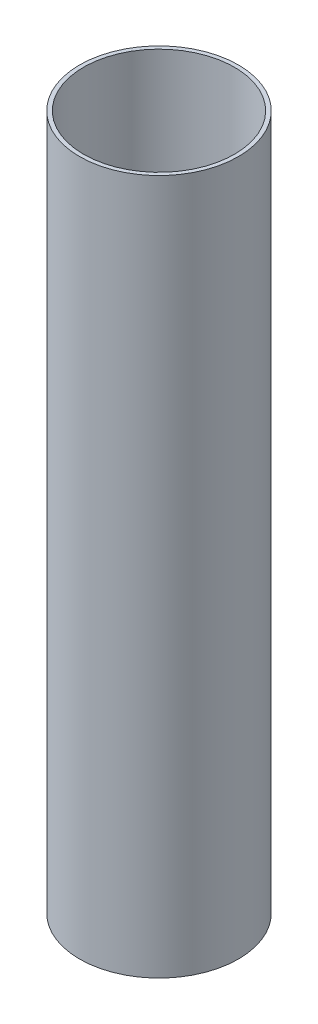
ISO-10303-21;
HEADER;
FILE_DESCRIPTION(('STEP AP214'),'2;1');
FILE_NAME('part.step','',(''),(''),'','','');
FILE_SCHEMA(('AUTOMOTIVE_DESIGN { 1 0 10303 214 1 1 1 1 }'));
ENDSEC;
DATA;
#1=APPLICATION_CONTEXT('core data for automotive mechanical design processes');
#2=APPLICATION_PROTOCOL_DEFINITION('international standard','automotive_design',2000,#1);
#3=PRODUCT_CONTEXT('',#1,'mechanical');
#4=PRODUCT('Part','Part','',(#3));
#5=PRODUCT_RELATED_PRODUCT_CATEGORY('part','',(#4));
#6=PRODUCT_DEFINITION_FORMATION('','',#4);
#7=PRODUCT_DEFINITION_CONTEXT('part definition',#1,'design');
#8=PRODUCT_DEFINITION('design','',#6,#7);
#9=PRODUCT_DEFINITION_SHAPE('','',#8);
#10=(LENGTH_UNIT() NAMED_UNIT(*) SI_UNIT(.MILLI.,.METRE.));
#11=(NAMED_UNIT(*) PLANE_ANGLE_UNIT() SI_UNIT($,.RADIAN.));
#12=(NAMED_UNIT(*) SI_UNIT($,.STERADIAN.) SOLID_ANGLE_UNIT());
#13=UNCERTAINTY_MEASURE_WITH_UNIT(LENGTH_MEASURE(1.E-05),#10,'distance_accuracy_value','');
#14=(GEOMETRIC_REPRESENTATION_CONTEXT(3) GLOBAL_UNCERTAINTY_ASSIGNED_CONTEXT((#13)) GLOBAL_UNIT_ASSIGNED_CONTEXT((#10,
#11,#12)) REPRESENTATION_CONTEXT('',''));
#15=CARTESIAN_POINT('',(0.,0.,0.));
#16=DIRECTION('',(0.,0.,1.));
#17=DIRECTION('',(1.,0.,0.));
#18=AXIS2_PLACEMENT_3D('',#15,#16,#17);
#19=CARTESIAN_POINT('',(0.,350.,0.));
#20=DIRECTION('',(0.,1.,0.));
#21=DIRECTION('',(0.,0.,1.));
#22=AXIS2_PLACEMENT_3D('',#19,#20,#21);
#23=PLANE('',#22);
#24=CARTESIAN_POINT('',(0.,350.,0.));
#25=DIRECTION('',(0.,1.,0.));
#26=DIRECTION('',(0.,0.,1.));
#27=AXIS2_PLACEMENT_3D('',#24,#25,#26);
#28=CIRCLE('',#27,40.);
#29=CARTESIAN_POINT('',(0.,350.,40.));
#30=VERTEX_POINT('',#29);
#31=EDGE_CURVE('E10',#30,#30,#28,.T.);
#32=ORIENTED_EDGE('',*,*,#31,.T.);
#33=EDGE_LOOP('',(#32));
#34=FACE_BOUND('',#33,.T.);
#35=CARTESIAN_POINT('',(0.,350.,0.));
#36=DIRECTION('',(0.,1.,0.));
#37=DIRECTION('',(0.,0.,1.));
#38=AXIS2_PLACEMENT_3D('',#35,#36,#37);
#39=CIRCLE('',#38,38.);
#40=CARTESIAN_POINT('',(0.,350.,38.));
#41=VERTEX_POINT('',#40);
#42=EDGE_CURVE('E52',#41,#41,#39,.T.);
#43=ORIENTED_EDGE('',*,*,#42,.F.);
#44=EDGE_LOOP('',(#43));
#45=FACE_BOUND('',#44,.T.);
#46=ADVANCED_FACE('F41',(#34,#45),#23,.T.);
#47=CARTESIAN_POINT('',(0.,0.,0.));
#48=DIRECTION('',(0.,1.,0.));
#49=DIRECTION('',(0.,0.,1.));
#50=AXIS2_PLACEMENT_3D('',#47,#48,#49);
#51=PLANE('',#50);
#52=CARTESIAN_POINT('',(0.,0.,0.));
#53=DIRECTION('',(0.,1.,0.));
#54=DIRECTION('',(0.,0.,1.));
#55=AXIS2_PLACEMENT_3D('',#52,#53,#54);
#56=CIRCLE('',#55,40.);
#57=CARTESIAN_POINT('',(0.,0.,40.));
#58=VERTEX_POINT('',#57);
#59=EDGE_CURVE('E45',#58,#58,#56,.T.);
#60=ORIENTED_EDGE('',*,*,#59,.F.);
#61=EDGE_LOOP('',(#60));
#62=FACE_BOUND('',#61,.T.);
#63=CARTESIAN_POINT('',(0.,0.,0.));
#64=DIRECTION('',(0.,1.,0.));
#65=DIRECTION('',(0.,0.,1.));
#66=AXIS2_PLACEMENT_3D('',#63,#64,#65);
#67=CIRCLE('',#66,38.);
#68=CARTESIAN_POINT('',(0.,0.,38.));
#69=VERTEX_POINT('',#68);
#70=EDGE_CURVE('E54',#69,#69,#67,.T.);
#71=ORIENTED_EDGE('',*,*,#70,.T.);
#72=EDGE_LOOP('',(#71));
#73=FACE_BOUND('',#72,.T.);
#74=ADVANCED_FACE('F64',(#62,#73),#51,.F.);
#75=CARTESIAN_POINT('',(0.,350.,0.));
#76=DIRECTION('',(0.,-1.,0.));
#77=DIRECTION('',(0.,0.,-1.));
#78=AXIS2_PLACEMENT_3D('',#75,#76,#77);
#79=CYLINDRICAL_SURFACE('',#78,40.);
#80=ORIENTED_EDGE('',*,*,#31,.F.);
#81=EDGE_LOOP('',(#80));
#82=FACE_BOUND('',#81,.T.);
#83=ORIENTED_EDGE('',*,*,#59,.T.);
#84=EDGE_LOOP('',(#83));
#85=FACE_BOUND('',#84,.T.);
#86=ADVANCED_FACE('F43',(#82,#85),#79,.T.);
#87=CARTESIAN_POINT('',(0.,350.,0.));
#88=DIRECTION('',(0.,-1.,0.));
#89=DIRECTION('',(0.,0.,-1.));
#90=AXIS2_PLACEMENT_3D('',#87,#88,#89);
#91=CYLINDRICAL_SURFACE('',#90,38.);
#92=ORIENTED_EDGE('',*,*,#42,.T.);
#93=EDGE_LOOP('',(#92));
#94=FACE_BOUND('',#93,.T.);
#95=ORIENTED_EDGE('',*,*,#70,.F.);
#96=EDGE_LOOP('',(#95));
#97=FACE_BOUND('',#96,.T.);
#98=ADVANCED_FACE('F60',(#94,#97),#91,.F.);
#99=CLOSED_SHELL('',(#46,#74,#86,#98));
#100=MANIFOLD_SOLID_BREP('B2',#99);
#101=ADVANCED_BREP_SHAPE_REPRESENTATION('',(#18,#100),#14);
#102=SHAPE_DEFINITION_REPRESENTATION(#9,#101);
ENDSEC;
END-ISO-10303-21;
